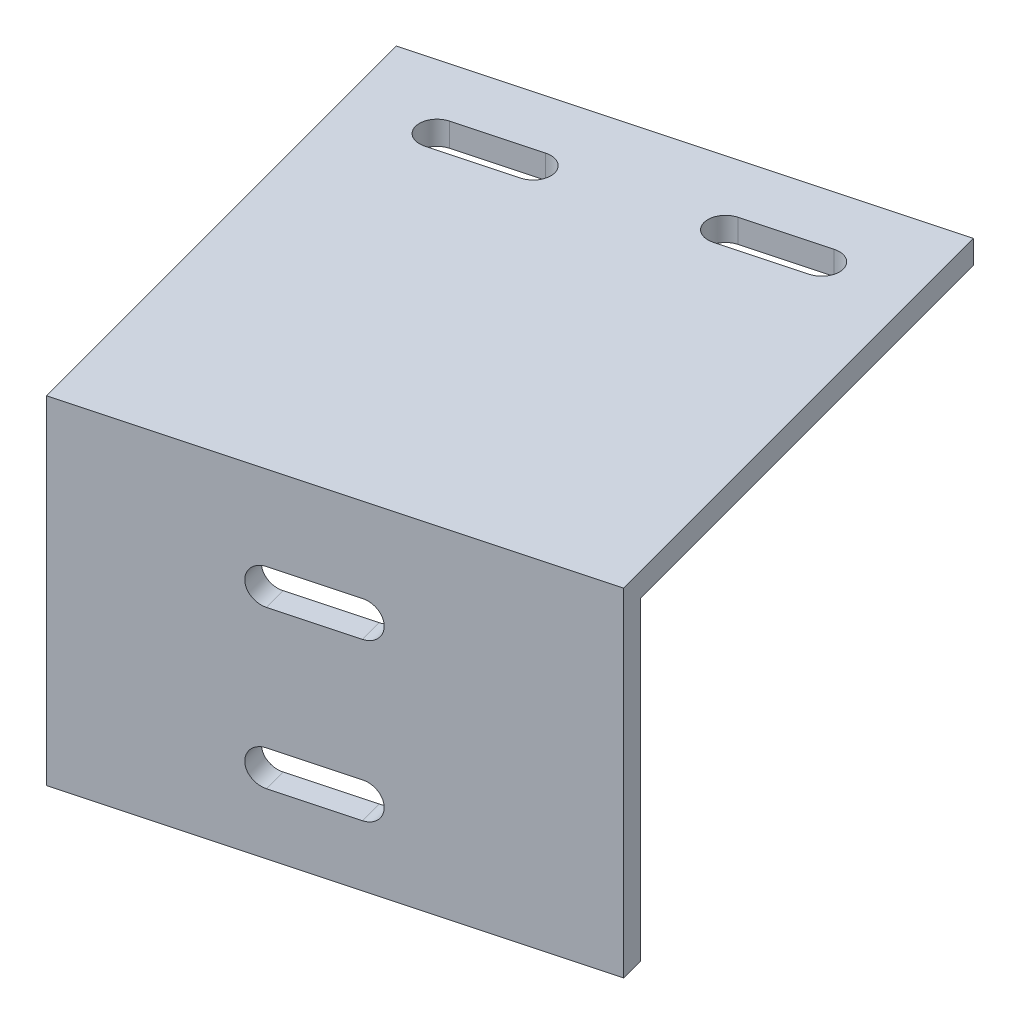
ISO-10303-21;
HEADER;
FILE_DESCRIPTION(('STEP AP214'),'2;1');
FILE_NAME('part.step','',(''),(''),'','','');
FILE_SCHEMA(('AUTOMOTIVE_DESIGN { 1 0 10303 214 1 1 1 1 }'));
ENDSEC;
DATA;
#1=APPLICATION_CONTEXT('core data for automotive mechanical design processes');
#2=APPLICATION_PROTOCOL_DEFINITION('international standard','automotive_design',2000,#1);
#3=PRODUCT_CONTEXT('',#1,'mechanical');
#4=PRODUCT('Part','Part','',(#3));
#5=PRODUCT_RELATED_PRODUCT_CATEGORY('part','',(#4));
#6=PRODUCT_DEFINITION_FORMATION('','',#4);
#7=PRODUCT_DEFINITION_CONTEXT('part definition',#1,'design');
#8=PRODUCT_DEFINITION('design','',#6,#7);
#9=PRODUCT_DEFINITION_SHAPE('','',#8);
#10=(LENGTH_UNIT() NAMED_UNIT(*) SI_UNIT(.MILLI.,.METRE.));
#11=(NAMED_UNIT(*) PLANE_ANGLE_UNIT() SI_UNIT($,.RADIAN.));
#12=(NAMED_UNIT(*) SI_UNIT($,.STERADIAN.) SOLID_ANGLE_UNIT());
#13=UNCERTAINTY_MEASURE_WITH_UNIT(LENGTH_MEASURE(1.E-05),#10,'distance_accuracy_value','');
#14=(GEOMETRIC_REPRESENTATION_CONTEXT(3) GLOBAL_UNCERTAINTY_ASSIGNED_CONTEXT((#13)) GLOBAL_UNIT_ASSIGNED_CONTEXT((#10,
#11,#12)) REPRESENTATION_CONTEXT('',''));
#15=CARTESIAN_POINT('',(0.,0.,0.));
#16=DIRECTION('',(0.,0.,1.));
#17=DIRECTION('',(1.,0.,0.));
#18=AXIS2_PLACEMENT_3D('',#15,#16,#17);
#19=CARTESIAN_POINT('',(602.4097368096,-56.5,1913.857974836));
#20=DIRECTION('',(0.,-1.,0.));
#21=DIRECTION('',(0.,0.,-1.));
#22=AXIS2_PLACEMENT_3D('',#19,#20,#21);
#23=PLANE('',#22);
#24=DIRECTION('',(0.258819045102985,0.,0.965925826288944));
#25=VECTOR('',#24,1.);
#26=CARTESIAN_POINT('',(583.09122028382,-56.5,1919.034355738));
#27=LINE('',#26,#25);
#28=CARTESIAN_POINT('',(583.09380847427,-56.5,1919.044014997));
#29=VERTEX_POINT('',#28);
#30=CARTESIAN_POINT('',(584.64672274488,-56.5,1924.839569954));
#31=VERTEX_POINT('',#30);
#32=EDGE_CURVE('E11',#29,#31,#27,.T.);
#33=ORIENTED_EDGE('',*,*,#32,.T.);
#34=DIRECTION('',(0.965925826288944,0.,-0.258819045102985));
#35=VECTOR('',#34,1.);
#36=CARTESIAN_POINT('',(572.22838771132,-56.5,1928.167052798));
#37=LINE('',#36,#35);
#38=CARTESIAN_POINT('',(603.96523927067,-56.5,1919.663189052));
#39=VERTEX_POINT('',#38);
#40=EDGE_CURVE('E191',#31,#39,#37,.T.);
#41=ORIENTED_EDGE('',*,*,#40,.T.);
#42=DIRECTION('',(0.258819045102985,0.,0.965925826288944));
#43=VECTOR('',#42,1.);
#44=CARTESIAN_POINT('',(602.4097368096,-56.5,1913.857974836));
#45=LINE('',#44,#43);
#46=CARTESIAN_POINT('',(602.41232500005,-56.5,1913.867634095));
#47=VERTEX_POINT('',#46);
#48=EDGE_CURVE('E20',#47,#39,#45,.T.);
#49=ORIENTED_EDGE('',*,*,#48,.F.);
#50=DIRECTION('',(0.965925826288944,0.,-0.258819045102985));
#51=VECTOR('',#50,1.);
#52=CARTESIAN_POINT('',(570.67547344071,-56.5,1922.37149784));
#53=LINE('',#52,#51);
#54=EDGE_CURVE('E231',#29,#47,#53,.T.);
#55=ORIENTED_EDGE('',*,*,#54,.F.);
#56=EDGE_LOOP('',(#33,#41,#49,#55));
#57=FACE_BOUND('',#56,.T.);
#58=ADVANCED_FACE('F17',(#57),#23,.F.);
#59=CARTESIAN_POINT('',(583.09122028382,-52.,1919.034355738));
#60=DIRECTION('',(-0.258819045102985,0.,-0.965925826288944));
#61=DIRECTION('',(0.,-1.,0.));
#62=AXIS2_PLACEMENT_3D('',#59,#60,#61);
#63=CYLINDRICAL_SURFACE('',#62,4.5);
#64=DIRECTION('',(0.258819045102985,0.,0.965925826288944));
#65=VECTOR('',#64,1.);
#66=CARTESIAN_POINT('',(583.09122028382,-47.5,1919.034355738));
#67=LINE('',#66,#65);
#68=CARTESIAN_POINT('',(583.09380847427,-47.5,1919.044014997));
#69=VERTEX_POINT('',#68);
#70=CARTESIAN_POINT('',(584.64672274488,-47.5,1924.839569954));
#71=VERTEX_POINT('',#70);
#72=EDGE_CURVE('E76',#69,#71,#67,.T.);
#73=ORIENTED_EDGE('',*,*,#72,.T.);
#74=CARTESIAN_POINT('',(584.64672274488,-52.,1924.839569954));
#75=DIRECTION('',(-0.258819045102985,0.,-0.965925826288944));
#76=DIRECTION('',(0.,-1.,0.));
#77=AXIS2_PLACEMENT_3D('',#74,#75,#76);
#78=CIRCLE('',#77,4.5);
#79=EDGE_CURVE('E194',#31,#71,#78,.T.);
#80=ORIENTED_EDGE('',*,*,#79,.F.);
#81=ORIENTED_EDGE('',*,*,#32,.F.);
#82=CARTESIAN_POINT('',(583.09380847427,-52.,1919.044014997));
#83=DIRECTION('',(-0.258819045102985,0.,-0.965925826288944));
#84=DIRECTION('',(0.,-1.,0.));
#85=AXIS2_PLACEMENT_3D('',#82,#83,#84);
#86=CIRCLE('',#85,4.5);
#87=EDGE_CURVE('E228',#29,#69,#86,.T.);
#88=ORIENTED_EDGE('',*,*,#87,.T.);
#89=EDGE_LOOP('',(#73,#80,#81,#88));
#90=FACE_BOUND('',#89,.T.);
#91=ADVANCED_FACE('F551',(#90),#63,.F.);
#92=CARTESIAN_POINT('',(602.4097368096,-52.,1913.857974836));
#93=DIRECTION('',(-0.258819045102985,0.,-0.965925826288944));
#94=DIRECTION('',(0.,1.,0.));
#95=AXIS2_PLACEMENT_3D('',#92,#93,#94);
#96=CYLINDRICAL_SURFACE('',#95,4.5);
#97=ORIENTED_EDGE('',*,*,#48,.T.);
#98=CARTESIAN_POINT('',(603.96523927067,-52.,1919.663189052));
#99=DIRECTION('',(-0.258819045102985,0.,-0.965925826288944));
#100=DIRECTION('',(0.,1.,0.));
#101=AXIS2_PLACEMENT_3D('',#98,#99,#100);
#102=CIRCLE('',#101,4.5);
#103=CARTESIAN_POINT('',(603.96523927067,-47.5,1919.663189052));
#104=VERTEX_POINT('',#103);
#105=EDGE_CURVE('E183',#104,#39,#102,.T.);
#106=ORIENTED_EDGE('',*,*,#105,.F.);
#107=DIRECTION('',(0.258819045102985,0.,0.965925826288944));
#108=VECTOR('',#107,1.);
#109=CARTESIAN_POINT('',(602.4097368096,-47.5,1913.857974836));
#110=LINE('',#109,#108);
#111=CARTESIAN_POINT('',(602.41232500005,-47.5,1913.867634095));
#112=VERTEX_POINT('',#111);
#113=EDGE_CURVE('E39',#112,#104,#110,.T.);
#114=ORIENTED_EDGE('',*,*,#113,.F.);
#115=CARTESIAN_POINT('',(602.41232500005,-52.,1913.867634095));
#116=DIRECTION('',(-0.258819045102985,0.,-0.965925826288944));
#117=DIRECTION('',(0.,1.,0.));
#118=AXIS2_PLACEMENT_3D('',#115,#116,#117);
#119=CIRCLE('',#118,4.5);
#120=EDGE_CURVE('E186',#112,#47,#119,.T.);
#121=ORIENTED_EDGE('',*,*,#120,.T.);
#122=EDGE_LOOP('',(#97,#106,#114,#121));
#123=FACE_BOUND('',#122,.T.);
#124=ADVANCED_FACE('F181',(#123),#96,.F.);
#125=CARTESIAN_POINT('',(583.09122028382,-47.5,1919.034355738));
#126=DIRECTION('',(0.,1.,0.));
#127=DIRECTION('',(1.,0.,0.));
#128=AXIS2_PLACEMENT_3D('',#125,#126,#127);
#129=PLANE('',#128);
#130=ORIENTED_EDGE('',*,*,#113,.T.);
#131=DIRECTION('',(-0.965925826288944,0.,0.258819045102985));
#132=VECTOR('',#131,1.);
#133=CARTESIAN_POINT('',(562.56912944843,-47.5,1930.755243249));
#134=LINE('',#133,#132);
#135=EDGE_CURVE('E198',#104,#71,#134,.T.);
#136=ORIENTED_EDGE('',*,*,#135,.T.);
#137=ORIENTED_EDGE('',*,*,#72,.F.);
#138=DIRECTION('',(-0.965925826288944,0.,0.258819045102985));
#139=VECTOR('',#138,1.);
#140=CARTESIAN_POINT('',(561.01621517782,-47.5,1924.959688291));
#141=LINE('',#140,#139);
#142=EDGE_CURVE('E247',#112,#69,#141,.T.);
#143=ORIENTED_EDGE('',*,*,#142,.F.);
#144=EDGE_LOOP('',(#130,#136,#137,#143));
#145=FACE_BOUND('',#144,.T.);
#146=ADVANCED_FACE('F560',(#145),#129,.F.);
#147=CARTESIAN_POINT('',(602.4097368096,-92.,1913.857974836));
#148=DIRECTION('',(-0.258819045102985,0.,-0.965925826288944));
#149=DIRECTION('',(0.,1.,0.));
#150=AXIS2_PLACEMENT_3D('',#147,#148,#149);
#151=CYLINDRICAL_SURFACE('',#150,4.5);
#152=DIRECTION('',(0.258819045102985,0.,0.965925826288944));
#153=VECTOR('',#152,1.);
#154=CARTESIAN_POINT('',(602.4097368096,-96.5,1913.857974836));
#155=LINE('',#154,#153);
#156=CARTESIAN_POINT('',(602.41232500005,-96.5,1913.867634095));
#157=VERTEX_POINT('',#156);
#158=CARTESIAN_POINT('',(603.96523927067,-96.5,1919.663189052));
#159=VERTEX_POINT('',#158);
#160=EDGE_CURVE('E209',#157,#159,#155,.T.);
#161=ORIENTED_EDGE('',*,*,#160,.T.);
#162=CARTESIAN_POINT('',(603.96523927067,-92.,1919.663189052));
#163=DIRECTION('',(-0.258819045102985,0.,-0.965925826288944));
#164=DIRECTION('',(0.,1.,0.));
#165=AXIS2_PLACEMENT_3D('',#162,#163,#164);
#166=CIRCLE('',#165,4.5);
#167=CARTESIAN_POINT('',(603.96523927067,-87.5,1919.663189052));
#168=VERTEX_POINT('',#167);
#169=EDGE_CURVE('E340',#168,#159,#166,.T.);
#170=ORIENTED_EDGE('',*,*,#169,.F.);
#171=DIRECTION('',(0.258819045102985,0.,0.965925826288944));
#172=VECTOR('',#171,1.);
#173=CARTESIAN_POINT('',(602.4097368096,-87.5,1913.857974836));
#174=LINE('',#173,#172);
#175=CARTESIAN_POINT('',(602.41232500005,-87.5,1913.867634095));
#176=VERTEX_POINT('',#175);
#177=EDGE_CURVE('E232',#176,#168,#174,.T.);
#178=ORIENTED_EDGE('',*,*,#177,.F.);
#179=CARTESIAN_POINT('',(602.41232500005,-92.,1913.867634095));
#180=DIRECTION('',(-0.258819045102985,0.,-0.965925826288944));
#181=DIRECTION('',(0.,1.,0.));
#182=AXIS2_PLACEMENT_3D('',#179,#180,#181);
#183=CIRCLE('',#182,4.5);
#184=EDGE_CURVE('E219',#176,#157,#183,.T.);
#185=ORIENTED_EDGE('',*,*,#184,.T.);
#186=EDGE_LOOP('',(#161,#170,#178,#185));
#187=FACE_BOUND('',#186,.T.);
#188=ADVANCED_FACE('F565',(#187),#151,.F.);
#189=CARTESIAN_POINT('',(602.4097368096,-96.5,1913.857974836));
#190=DIRECTION('',(0.,-1.,0.));
#191=DIRECTION('',(0.,0.,-1.));
#192=AXIS2_PLACEMENT_3D('',#189,#190,#191);
#193=PLANE('',#192);
#194=DIRECTION('',(0.258819045102985,0.,0.965925826288944));
#195=VECTOR('',#194,1.);
#196=CARTESIAN_POINT('',(583.09122028382,-96.5,1919.034355738));
#197=LINE('',#196,#195);
#198=CARTESIAN_POINT('',(583.09380847427,-96.5,1919.044014997));
#199=VERTEX_POINT('',#198);
#200=CARTESIAN_POINT('',(584.64672274488,-96.5,1924.839569954));
#201=VERTEX_POINT('',#200);
#202=EDGE_CURVE('E212',#199,#201,#197,.T.);
#203=ORIENTED_EDGE('',*,*,#202,.T.);
#204=DIRECTION('',(0.965925826288944,0.,-0.258819045102985));
#205=VECTOR('',#204,1.);
#206=CARTESIAN_POINT('',(572.22838771132,-96.5,1928.167052798));
#207=LINE('',#206,#205);
#208=EDGE_CURVE('E345',#201,#159,#207,.T.);
#209=ORIENTED_EDGE('',*,*,#208,.T.);
#210=ORIENTED_EDGE('',*,*,#160,.F.);
#211=DIRECTION('',(0.965925826288944,0.,-0.258819045102985));
#212=VECTOR('',#211,1.);
#213=CARTESIAN_POINT('',(570.67547344071,-96.5,1922.37149784));
#214=LINE('',#213,#212);
#215=EDGE_CURVE('E224',#199,#157,#214,.T.);
#216=ORIENTED_EDGE('',*,*,#215,.F.);
#217=EDGE_LOOP('',(#203,#209,#210,#216));
#218=FACE_BOUND('',#217,.T.);
#219=ADVANCED_FACE('F568',(#218),#193,.F.);
#220=CARTESIAN_POINT('',(583.09122028382,-92.,1919.034355738));
#221=DIRECTION('',(-0.258819045102985,0.,-0.965925826288944));
#222=DIRECTION('',(0.,-1.,0.));
#223=AXIS2_PLACEMENT_3D('',#220,#221,#222);
#224=CYLINDRICAL_SURFACE('',#223,4.5);
#225=DIRECTION('',(0.258819045102985,0.,0.965925826288944));
#226=VECTOR('',#225,1.);
#227=CARTESIAN_POINT('',(583.09122028382,-87.5,1919.034355738));
#228=LINE('',#227,#226);
#229=CARTESIAN_POINT('',(583.09380847427,-87.5,1919.044014997));
#230=VERTEX_POINT('',#229);
#231=CARTESIAN_POINT('',(584.64672274488,-87.5,1924.839569954));
#232=VERTEX_POINT('',#231);
#233=EDGE_CURVE('E235',#230,#232,#228,.T.);
#234=ORIENTED_EDGE('',*,*,#233,.T.);
#235=CARTESIAN_POINT('',(584.64672274488,-92.,1924.839569954));
#236=DIRECTION('',(-0.258819045102985,0.,-0.965925826288944));
#237=DIRECTION('',(0.,-1.,0.));
#238=AXIS2_PLACEMENT_3D('',#235,#236,#237);
#239=CIRCLE('',#238,4.5);
#240=EDGE_CURVE('E204',#201,#232,#239,.T.);
#241=ORIENTED_EDGE('',*,*,#240,.F.);
#242=ORIENTED_EDGE('',*,*,#202,.F.);
#243=CARTESIAN_POINT('',(583.09380847427,-92.,1919.044014997));
#244=DIRECTION('',(-0.258819045102985,0.,-0.965925826288944));
#245=DIRECTION('',(0.,-1.,0.));
#246=AXIS2_PLACEMENT_3D('',#243,#244,#245);
#247=CIRCLE('',#246,4.5);
#248=EDGE_CURVE('E286',#199,#230,#247,.T.);
#249=ORIENTED_EDGE('',*,*,#248,.T.);
#250=EDGE_LOOP('',(#234,#241,#242,#249));
#251=FACE_BOUND('',#250,.T.);
#252=ADVANCED_FACE('F572',(#251),#224,.F.);
#253=CARTESIAN_POINT('',(583.09122028382,-87.5,1919.034355738));
#254=DIRECTION('',(0.,1.,0.));
#255=DIRECTION('',(1.,0.,0.));
#256=AXIS2_PLACEMENT_3D('',#253,#254,#255);
#257=PLANE('',#256);
#258=ORIENTED_EDGE('',*,*,#177,.T.);
#259=DIRECTION('',(-0.965925826288944,0.,0.258819045102985));
#260=VECTOR('',#259,1.);
#261=CARTESIAN_POINT('',(562.56912944843,-87.5,1930.755243249));
#262=LINE('',#261,#260);
#263=EDGE_CURVE('E336',#168,#232,#262,.T.);
#264=ORIENTED_EDGE('',*,*,#263,.T.);
#265=ORIENTED_EDGE('',*,*,#233,.F.);
#266=DIRECTION('',(-0.965925826288944,0.,0.258819045102985));
#267=VECTOR('',#266,1.);
#268=CARTESIAN_POINT('',(561.01621517782,-87.5,1924.959688291));
#269=LINE('',#268,#267);
#270=EDGE_CURVE('E223',#176,#230,#269,.T.);
#271=ORIENTED_EDGE('',*,*,#270,.F.);
#272=EDGE_LOOP('',(#258,#264,#265,#271));
#273=FACE_BOUND('',#272,.T.);
#274=ADVANCED_FACE('F575',(#273),#257,.F.);
#275=CARTESIAN_POINT('',(590.33078347423,-25.99,1813.577255349));
#276=DIRECTION('',(0.,1.,0.));
#277=DIRECTION('',(-0.258819045102985,0.,-0.965925826288944));
#278=AXIS2_PLACEMENT_3D('',#275,#276,#277);
#279=CYLINDRICAL_SURFACE('',#278,4.5);
#280=DIRECTION('',(0.,-1.,0.));
#281=VECTOR('',#280,1.);
#282=CARTESIAN_POINT('',(591.4954691772,-25.99,1817.923921567));
#283=LINE('',#282,#281);
#284=CARTESIAN_POINT('',(591.4954691772,-26.,1817.923921567));
#285=VERTEX_POINT('',#284);
#286=CARTESIAN_POINT('',(591.4954691772,-32.,1817.923921567));
#287=VERTEX_POINT('',#286);
#288=EDGE_CURVE('E258',#285,#287,#283,.T.);
#289=ORIENTED_EDGE('',*,*,#288,.T.);
#290=CARTESIAN_POINT('',(590.33078347423,-32.,1813.577255349));
#291=DIRECTION('',(0.,1.,0.));
#292=DIRECTION('',(-0.258819045102985,0.,-0.965925826288944));
#293=AXIS2_PLACEMENT_3D('',#290,#291,#292);
#294=CIRCLE('',#293,4.5);
#295=CARTESIAN_POINT('',(589.16609777127,-32.,1809.23058913));
#296=VERTEX_POINT('',#295);
#297=EDGE_CURVE('E379',#296,#287,#294,.T.);
#298=ORIENTED_EDGE('',*,*,#297,.F.);
#299=DIRECTION('',(0.,-1.,0.));
#300=VECTOR('',#299,1.);
#301=CARTESIAN_POINT('',(589.16609777127,-25.99,1809.23058913));
#302=LINE('',#301,#300);
#303=CARTESIAN_POINT('',(589.16609777127,-26.,1809.23058913));
#304=VERTEX_POINT('',#303);
#305=EDGE_CURVE('E236',#304,#296,#302,.T.);
#306=ORIENTED_EDGE('',*,*,#305,.F.);
#307=CARTESIAN_POINT('',(590.33078347423,-26.,1813.577255349));
#308=DIRECTION('',(0.,1.,0.));
#309=DIRECTION('',(-0.258819045102985,0.,-0.965925826288944));
#310=AXIS2_PLACEMENT_3D('',#307,#308,#309);
#311=CIRCLE('',#310,4.5);
#312=EDGE_CURVE('E309',#304,#285,#311,.T.);
#313=ORIENTED_EDGE('',*,*,#312,.T.);
#314=EDGE_LOOP('',(#289,#298,#306,#313));
#315=FACE_BOUND('',#314,.T.);
#316=ADVANCED_FACE('F436',(#315),#279,.F.);
#317=CARTESIAN_POINT('',(608.48461429705,-25.99,1804.054208228));
#318=DIRECTION('',(-0.258819045102985,0.,-0.965925826288944));
#319=DIRECTION('',(-0.965925826288944,0.,0.258819045102985));
#320=AXIS2_PLACEMENT_3D('',#317,#318,#319);
#321=PLANE('',#320);
#322=ORIENTED_EDGE('',*,*,#305,.T.);
#323=DIRECTION('',(-0.965925826288944,0.,0.258819045102985));
#324=VECTOR('',#323,1.);
#325=CARTESIAN_POINT('',(560.1883229826,-32.,1816.995160484));
#326=LINE('',#325,#324);
#327=CARTESIAN_POINT('',(608.48461429705,-32.,1804.054208228));
#328=VERTEX_POINT('',#327);
#329=EDGE_CURVE('E376',#328,#296,#326,.T.);
#330=ORIENTED_EDGE('',*,*,#329,.F.);
#331=DIRECTION('',(0.,-1.,0.));
#332=VECTOR('',#331,1.);
#333=CARTESIAN_POINT('',(608.48461429705,-25.99,1804.054208228));
#334=LINE('',#333,#332);
#335=CARTESIAN_POINT('',(608.48461429705,-26.,1804.054208228));
#336=VERTEX_POINT('',#335);
#337=EDGE_CURVE('E255',#336,#328,#334,.T.);
#338=ORIENTED_EDGE('',*,*,#337,.F.);
#339=DIRECTION('',(-0.965925826288944,0.,0.258819045102985));
#340=VECTOR('',#339,1.);
#341=CARTESIAN_POINT('',(560.1883229826,-26.,1816.995160484));
#342=LINE('',#341,#340);
#343=EDGE_CURVE('E304',#336,#304,#342,.T.);
#344=ORIENTED_EDGE('',*,*,#343,.T.);
#345=EDGE_LOOP('',(#322,#330,#338,#344));
#346=FACE_BOUND('',#345,.T.);
#347=ADVANCED_FACE('F432',(#346),#321,.F.);
#348=CARTESIAN_POINT('',(609.64930000002,-25.99,1808.400874447));
#349=DIRECTION('',(0.,1.,0.));
#350=DIRECTION('',(0.258819045102985,0.,0.965925826288944));
#351=AXIS2_PLACEMENT_3D('',#348,#349,#350);
#352=CYLINDRICAL_SURFACE('',#351,4.5);
#353=ORIENTED_EDGE('',*,*,#337,.T.);
#354=CARTESIAN_POINT('',(609.64930000002,-32.,1808.400874447));
#355=DIRECTION('',(0.,1.,0.));
#356=DIRECTION('',(0.258819045102985,0.,0.965925826288944));
#357=AXIS2_PLACEMENT_3D('',#354,#355,#356);
#358=CIRCLE('',#357,4.5);
#359=CARTESIAN_POINT('',(610.81398570298,-32.,1812.747540665));
#360=VERTEX_POINT('',#359);
#361=EDGE_CURVE('E380',#360,#328,#358,.T.);
#362=ORIENTED_EDGE('',*,*,#361,.F.);
#363=DIRECTION('',(0.,-1.,0.));
#364=VECTOR('',#363,1.);
#365=CARTESIAN_POINT('',(610.81398570298,-25.99,1812.747540665));
#366=LINE('',#365,#364);
#367=CARTESIAN_POINT('',(610.81398570298,-26.,1812.747540665));
#368=VERTEX_POINT('',#367);
#369=EDGE_CURVE('E241',#368,#360,#366,.T.);
#370=ORIENTED_EDGE('',*,*,#369,.F.);
#371=CARTESIAN_POINT('',(609.64930000002,-26.,1808.400874447));
#372=DIRECTION('',(0.,1.,0.));
#373=DIRECTION('',(0.258819045102985,0.,0.965925826288944));
#374=AXIS2_PLACEMENT_3D('',#371,#372,#373);
#375=CIRCLE('',#374,4.5);
#376=EDGE_CURVE('E308',#368,#336,#375,.T.);
#377=ORIENTED_EDGE('',*,*,#376,.T.);
#378=EDGE_LOOP('',(#353,#362,#370,#377));
#379=FACE_BOUND('',#378,.T.);
#380=ADVANCED_FACE('F427',(#379),#352,.F.);
#381=CARTESIAN_POINT('',(591.4954691772,-25.99,1817.923921567));
#382=DIRECTION('',(0.258819045102985,0.,0.965925826288944));
#383=DIRECTION('',(0.,-1.,0.));
#384=AXIS2_PLACEMENT_3D('',#381,#382,#383);
#385=PLANE('',#384);
#386=ORIENTED_EDGE('',*,*,#369,.T.);
#387=DIRECTION('',(0.965925826288944,0.,-0.258819045102985));
#388=VECTOR('',#387,1.);
#389=CARTESIAN_POINT('',(552.85843612563,-32.,1828.276683371));
#390=LINE('',#389,#388);
#391=EDGE_CURVE('E271',#287,#360,#390,.T.);
#392=ORIENTED_EDGE('',*,*,#391,.F.);
#393=ORIENTED_EDGE('',*,*,#288,.F.);
#394=DIRECTION('',(0.965925826288944,0.,-0.258819045102985));
#395=VECTOR('',#394,1.);
#396=CARTESIAN_POINT('',(552.85843612563,-26.,1828.276683371));
#397=LINE('',#396,#395);
#398=EDGE_CURVE('E314',#285,#368,#397,.T.);
#399=ORIENTED_EDGE('',*,*,#398,.T.);
#400=EDGE_LOOP('',(#386,#392,#393,#399));
#401=FACE_BOUND('',#400,.T.);
#402=ADVANCED_FACE('F581',(#401),#385,.F.);
#403=CARTESIAN_POINT('',(550.52906471971,-25.99,1819.583350935));
#404=DIRECTION('',(-0.258819045102985,0.,-0.965925826288944));
#405=DIRECTION('',(-0.965925826288944,0.,0.258819045102985));
#406=AXIS2_PLACEMENT_3D('',#403,#404,#405);
#407=PLANE('',#406);
#408=DIRECTION('',(0.,-1.,0.));
#409=VECTOR('',#408,1.);
#410=CARTESIAN_POINT('',(531.21054819393,-25.99,1824.759731837));
#411=LINE('',#410,#409);
#412=CARTESIAN_POINT('',(531.21054819393,-26.,1824.759731837));
#413=VERTEX_POINT('',#412);
#414=CARTESIAN_POINT('',(531.21054819393,-32.,1824.759731837));
#415=VERTEX_POINT('',#414);
#416=EDGE_CURVE('E242',#413,#415,#411,.T.);
#417=ORIENTED_EDGE('',*,*,#416,.T.);
#418=DIRECTION('',(-0.965925826288944,0.,0.258819045102985));
#419=VECTOR('',#418,1.);
#420=CARTESIAN_POINT('',(531.21054819393,-32.,1824.759731837));
#421=LINE('',#420,#419);
#422=CARTESIAN_POINT('',(550.52906471971,-32.,1819.583350935));
#423=VERTEX_POINT('',#422);
#424=EDGE_CURVE('E365',#423,#415,#421,.T.);
#425=ORIENTED_EDGE('',*,*,#424,.F.);
#426=DIRECTION('',(0.,-1.,0.));
#427=VECTOR('',#426,1.);
#428=CARTESIAN_POINT('',(550.52906471971,-25.99,1819.583350935));
#429=LINE('',#428,#427);
#430=CARTESIAN_POINT('',(550.52906471971,-26.,1819.583350935));
#431=VERTEX_POINT('',#430);
#432=EDGE_CURVE('E237',#431,#423,#429,.T.);
#433=ORIENTED_EDGE('',*,*,#432,.F.);
#434=DIRECTION('',(-0.965925826288944,0.,0.258819045102985));
#435=VECTOR('',#434,1.);
#436=CARTESIAN_POINT('',(531.21054819393,-26.,1824.759731837));
#437=LINE('',#436,#435);
#438=EDGE_CURVE('E301',#431,#413,#437,.T.);
#439=ORIENTED_EDGE('',*,*,#438,.T.);
#440=EDGE_LOOP('',(#417,#425,#433,#439));
#441=FACE_BOUND('',#440,.T.);
#442=ADVANCED_FACE('F509',(#441),#407,.F.);
#443=CARTESIAN_POINT('',(551.69375042267,-25.99,1823.930017153));
#444=DIRECTION('',(0.,1.,0.));
#445=DIRECTION('',(0.258819045102985,0.,0.965925826288944));
#446=AXIS2_PLACEMENT_3D('',#443,#444,#445);
#447=CYLINDRICAL_SURFACE('',#446,4.5);
#448=ORIENTED_EDGE('',*,*,#432,.T.);
#449=CARTESIAN_POINT('',(551.69375042267,-32.,1823.930017153));
#450=DIRECTION('',(0.,1.,0.));
#451=DIRECTION('',(0.258819045102985,0.,0.965925826288944));
#452=AXIS2_PLACEMENT_3D('',#449,#450,#451);
#453=CIRCLE('',#452,4.5);
#454=CARTESIAN_POINT('',(552.85843612563,-32.,1828.276683371));
#455=VERTEX_POINT('',#454);
#456=EDGE_CURVE('E398',#455,#423,#453,.T.);
#457=ORIENTED_EDGE('',*,*,#456,.F.);
#458=DIRECTION('',(0.,-1.,0.));
#459=VECTOR('',#458,1.);
#460=CARTESIAN_POINT('',(552.85843612563,-25.99,1828.276683371));
#461=LINE('',#460,#459);
#462=CARTESIAN_POINT('',(552.85843612563,-26.,1828.276683371));
#463=VERTEX_POINT('',#462);
#464=EDGE_CURVE('E248',#463,#455,#461,.T.);
#465=ORIENTED_EDGE('',*,*,#464,.F.);
#466=CARTESIAN_POINT('',(551.69375042267,-26.,1823.930017153));
#467=DIRECTION('',(0.,1.,0.));
#468=DIRECTION('',(0.258819045102985,0.,0.965925826288944));
#469=AXIS2_PLACEMENT_3D('',#466,#467,#468);
#470=CIRCLE('',#469,4.5);
#471=EDGE_CURVE('E310',#463,#431,#470,.T.);
#472=ORIENTED_EDGE('',*,*,#471,.T.);
#473=EDGE_LOOP('',(#448,#457,#465,#472));
#474=FACE_BOUND('',#473,.T.);
#475=ADVANCED_FACE('F505',(#474),#447,.F.);
#476=CARTESIAN_POINT('',(532.37523389689,-25.99,1829.106398055));
#477=DIRECTION('',(0.,1.,0.));
#478=DIRECTION('',(-0.258819045102985,0.,-0.965925826288944));
#479=AXIS2_PLACEMENT_3D('',#476,#477,#478);
#480=CYLINDRICAL_SURFACE('',#479,4.5);
#481=DIRECTION('',(0.,-1.,0.));
#482=VECTOR('',#481,1.);
#483=CARTESIAN_POINT('',(533.53991959985,-25.99,1833.453064273));
#484=LINE('',#483,#482);
#485=CARTESIAN_POINT('',(533.53991959985,-26.,1833.453064273));
#486=VERTEX_POINT('',#485);
#487=CARTESIAN_POINT('',(533.53991959985,-32.,1833.453064273));
#488=VERTEX_POINT('',#487);
#489=EDGE_CURVE('E252',#486,#488,#484,.T.);
#490=ORIENTED_EDGE('',*,*,#489,.T.);
#491=CARTESIAN_POINT('',(532.37523389689,-32.,1829.106398055));
#492=DIRECTION('',(0.,1.,0.));
#493=DIRECTION('',(-0.258819045102985,0.,-0.965925826288944));
#494=AXIS2_PLACEMENT_3D('',#491,#492,#493);
#495=CIRCLE('',#494,4.5);
#496=EDGE_CURVE('E361',#415,#488,#495,.T.);
#497=ORIENTED_EDGE('',*,*,#496,.F.);
#498=ORIENTED_EDGE('',*,*,#416,.F.);
#499=CARTESIAN_POINT('',(532.37523389689,-26.,1829.106398055));
#500=DIRECTION('',(0.,1.,0.));
#501=DIRECTION('',(-0.258819045102985,0.,-0.965925826288944));
#502=AXIS2_PLACEMENT_3D('',#499,#500,#501);
#503=CIRCLE('',#502,4.5);
#504=EDGE_CURVE('E297',#413,#486,#503,.T.);
#505=ORIENTED_EDGE('',*,*,#504,.T.);
#506=EDGE_LOOP('',(#490,#497,#498,#505));
#507=FACE_BOUND('',#506,.T.);
#508=ADVANCED_FACE('F516',(#507),#480,.F.);
#509=CARTESIAN_POINT('',(533.53991959985,-25.99,1833.453064273));
#510=DIRECTION('',(0.258819045102985,0.,0.965925826288944));
#511=DIRECTION('',(0.,-1.,0.));
#512=AXIS2_PLACEMENT_3D('',#509,#510,#511);
#513=PLANE('',#512);
#514=ORIENTED_EDGE('',*,*,#464,.T.);
#515=DIRECTION('',(0.965925826288944,0.,-0.258819045102985));
#516=VECTOR('',#515,1.);
#517=CARTESIAN_POINT('',(523.88066133696,-32.,1836.041254724));
#518=LINE('',#517,#516);
#519=EDGE_CURVE('E364',#488,#455,#518,.T.);
#520=ORIENTED_EDGE('',*,*,#519,.F.);
#521=ORIENTED_EDGE('',*,*,#489,.F.);
#522=DIRECTION('',(0.965925826288944,0.,-0.258819045102985));
#523=VECTOR('',#522,1.);
#524=CARTESIAN_POINT('',(523.88066133696,-26.,1836.041254724));
#525=LINE('',#524,#523);
#526=EDGE_CURVE('E293',#486,#463,#525,.T.);
#527=ORIENTED_EDGE('',*,*,#526,.T.);
#528=EDGE_LOOP('',(#514,#520,#521,#527));
#529=FACE_BOUND('',#528,.T.);
#530=ADVANCED_FACE('F512',(#529),#513,.F.);
#531=CARTESIAN_POINT('',(623.79143562375,-32.,1783.905977019));
#532=DIRECTION('',(0.965925826288944,0.,-0.258819045102985));
#533=DIRECTION('',(0.,-1.,0.));
#534=AXIS2_PLACEMENT_3D('',#531,#532,#533);
#535=PLANE('',#534);
#536=DIRECTION('',(0.258819045102985,0.,0.965925826288944));
#537=VECTOR('',#536,1.);
#538=CARTESIAN_POINT('',(623.79143562375,-32.,1783.905977019));
#539=LINE('',#538,#537);
#540=CARTESIAN_POINT('',(623.79143562375,-32.,1783.905977019));
#541=VERTEX_POINT('',#540);
#542=CARTESIAN_POINT('',(654.84972103605,-32.,1899.817076174));
#543=VERTEX_POINT('',#542);
#544=EDGE_CURVE('E394',#541,#543,#539,.T.);
#545=ORIENTED_EDGE('',*,*,#544,.F.);
#546=DIRECTION('',(0.,1.,0.));
#547=VECTOR('',#546,1.);
#548=CARTESIAN_POINT('',(623.79143562375,-32.,1783.905977019));
#549=LINE('',#548,#547);
#550=CARTESIAN_POINT('',(623.79143562375,-26.,1783.905977019));
#551=VERTEX_POINT('',#550);
#552=EDGE_CURVE('E275',#541,#551,#549,.T.);
#553=ORIENTED_EDGE('',*,*,#552,.T.);
#554=DIRECTION('',(-0.258819045102985,0.,-0.965925826288944));
#555=VECTOR('',#554,1.);
#556=CARTESIAN_POINT('',(656.40263530666,-26.,1905.612631131));
#557=LINE('',#556,#555);
#558=CARTESIAN_POINT('',(656.40263530666,-26.,1905.612631131));
#559=VERTEX_POINT('',#558);
#560=EDGE_CURVE('E290',#559,#551,#557,.T.);
#561=ORIENTED_EDGE('',*,*,#560,.F.);
#562=DIRECTION('',(0.,-1.,0.));
#563=VECTOR('',#562,1.);
#564=CARTESIAN_POINT('',(656.40263530666,-26.,1905.612631131));
#565=LINE('',#564,#563);
#566=CARTESIAN_POINT('',(656.40263530666,-112.,1905.612631131));
#567=VERTEX_POINT('',#566);
#568=EDGE_CURVE('E332',#559,#567,#565,.T.);
#569=ORIENTED_EDGE('',*,*,#568,.T.);
#570=DIRECTION('',(0.258819045102985,0.,0.965925826288944));
#571=VECTOR('',#570,1.);
#572=CARTESIAN_POINT('',(654.84972103605,-112.,1899.817076174));
#573=LINE('',#572,#571);
#574=CARTESIAN_POINT('',(654.84972103605,-112.,1899.817076174));
#575=VERTEX_POINT('',#574);
#576=EDGE_CURVE('E218',#575,#567,#573,.T.);
#577=ORIENTED_EDGE('',*,*,#576,.F.);
#578=DIRECTION('',(0.,1.,0.));
#579=VECTOR('',#578,1.);
#580=CARTESIAN_POINT('',(654.84972103605,-112.,1899.817076174));
#581=LINE('',#580,#579);
#582=EDGE_CURVE('E217',#575,#543,#581,.T.);
#583=ORIENTED_EDGE('',*,*,#582,.T.);
#584=EDGE_LOOP('',(#545,#553,#561,#569,#577,#583));
#585=FACE_BOUND('',#584,.T.);
#586=ADVANCED_FACE('F537',(#585),#535,.T.);
#587=CARTESIAN_POINT('',(538.93862188136,-112.,1930.875361586));
#588=DIRECTION('',(0.258819045102985,0.,0.965925826288944));
#589=DIRECTION('',(0.,-1.,0.));
#590=AXIS2_PLACEMENT_3D('',#587,#588,#589);
#591=PLANE('',#590);
#592=ORIENTED_EDGE('',*,*,#87,.F.);
#593=ORIENTED_EDGE('',*,*,#54,.T.);
#594=ORIENTED_EDGE('',*,*,#120,.F.);
#595=ORIENTED_EDGE('',*,*,#142,.T.);
#596=EDGE_LOOP('',(#592,#593,#594,#595));
#597=FACE_BOUND('',#596,.T.);
#598=ORIENTED_EDGE('',*,*,#248,.F.);
#599=ORIENTED_EDGE('',*,*,#215,.T.);
#600=ORIENTED_EDGE('',*,*,#184,.F.);
#601=ORIENTED_EDGE('',*,*,#270,.T.);
#602=EDGE_LOOP('',(#598,#599,#600,#601));
#603=FACE_BOUND('',#602,.T.);
#604=DIRECTION('',(0.965925826288944,0.,-0.258819045102985));
#605=VECTOR('',#604,1.);
#606=CARTESIAN_POINT('',(538.93862188136,-32.,1930.875361586));
#607=LINE('',#606,#605);
#608=CARTESIAN_POINT('',(538.93862188136,-32.,1930.875361586));
#609=VERTEX_POINT('',#608);
#610=EDGE_CURVE('E386',#609,#543,#607,.T.);
#611=ORIENTED_EDGE('',*,*,#610,.T.);
#612=ORIENTED_EDGE('',*,*,#582,.F.);
#613=DIRECTION('',(0.965925826288944,0.,-0.258819045102985));
#614=VECTOR('',#613,1.);
#615=CARTESIAN_POINT('',(538.93862188136,-112.,1930.875361586));
#616=LINE('',#615,#614);
#617=CARTESIAN_POINT('',(538.93862188136,-112.,1930.875361586));
#618=VERTEX_POINT('',#617);
#619=EDGE_CURVE('E213',#618,#575,#616,.T.);
#620=ORIENTED_EDGE('',*,*,#619,.F.);
#621=DIRECTION('',(0.,1.,0.));
#622=VECTOR('',#621,1.);
#623=CARTESIAN_POINT('',(538.93862188136,-112.,1930.875361586));
#624=LINE('',#623,#622);
#625=EDGE_CURVE('E447',#618,#609,#624,.T.);
#626=ORIENTED_EDGE('',*,*,#625,.T.);
#627=EDGE_LOOP('',(#611,#612,#620,#626));
#628=FACE_BOUND('',#627,.T.);
#629=ADVANCED_FACE('F533',(#597,#603,#628),#591,.F.);
#630=CARTESIAN_POINT('',(538.93862188136,-112.,1930.875361586));
#631=DIRECTION('',(0.,1.,0.));
#632=DIRECTION('',(1.,0.,0.));
#633=AXIS2_PLACEMENT_3D('',#630,#631,#632);
#634=PLANE('',#633);
#635=ORIENTED_EDGE('',*,*,#576,.T.);
#636=DIRECTION('',(0.965925826288944,0.,-0.258819045102985));
#637=VECTOR('',#636,1.);
#638=CARTESIAN_POINT('',(540.49153615198,-112.,1936.670916544));
#639=LINE('',#638,#637);
#640=CARTESIAN_POINT('',(540.49153615198,-112.,1936.670916544));
#641=VERTEX_POINT('',#640);
#642=EDGE_CURVE('E328',#641,#567,#639,.T.);
#643=ORIENTED_EDGE('',*,*,#642,.F.);
#644=DIRECTION('',(0.258819045102985,0.,0.965925826288944));
#645=VECTOR('',#644,1.);
#646=CARTESIAN_POINT('',(538.93862188136,-112.,1930.875361586));
#647=LINE('',#646,#645);
#648=EDGE_CURVE('E371',#618,#641,#647,.T.);
#649=ORIENTED_EDGE('',*,*,#648,.F.);
#650=ORIENTED_EDGE('',*,*,#619,.T.);
#651=EDGE_LOOP('',(#635,#643,#649,#650));
#652=FACE_BOUND('',#651,.T.);
#653=ADVANCED_FACE('F468',(#652),#634,.F.);
#654=CARTESIAN_POINT('',(540.49153615198,-32.,1936.670916544));
#655=DIRECTION('',(0.258819045102985,0.,0.965925826288944));
#656=DIRECTION('',(0.,-1.,0.));
#657=AXIS2_PLACEMENT_3D('',#654,#655,#656);
#658=PLANE('',#657);
#659=ORIENTED_EDGE('',*,*,#135,.F.);
#660=ORIENTED_EDGE('',*,*,#105,.T.);
#661=ORIENTED_EDGE('',*,*,#40,.F.);
#662=ORIENTED_EDGE('',*,*,#79,.T.);
#663=EDGE_LOOP('',(#659,#660,#661,#662));
#664=FACE_BOUND('',#663,.T.);
#665=ORIENTED_EDGE('',*,*,#263,.F.);
#666=ORIENTED_EDGE('',*,*,#169,.T.);
#667=ORIENTED_EDGE('',*,*,#208,.F.);
#668=ORIENTED_EDGE('',*,*,#240,.T.);
#669=EDGE_LOOP('',(#665,#666,#667,#668));
#670=FACE_BOUND('',#669,.T.);
#671=DIRECTION('',(0.,1.,0.));
#672=VECTOR('',#671,1.);
#673=CARTESIAN_POINT('',(540.49153615198,-112.,1936.670916544));
#674=LINE('',#673,#672);
#675=CARTESIAN_POINT('',(540.49153615198,-26.,1936.670916544));
#676=VERTEX_POINT('',#675);
#677=EDGE_CURVE('E366',#641,#676,#674,.T.);
#678=ORIENTED_EDGE('',*,*,#677,.F.);
#679=ORIENTED_EDGE('',*,*,#642,.T.);
#680=ORIENTED_EDGE('',*,*,#568,.F.);
#681=DIRECTION('',(0.965925826288944,0.,-0.258819045102985));
#682=VECTOR('',#681,1.);
#683=CARTESIAN_POINT('',(540.49153615198,-26.,1936.670916544));
#684=LINE('',#683,#682);
#685=EDGE_CURVE('E280',#676,#559,#684,.T.);
#686=ORIENTED_EDGE('',*,*,#685,.F.);
#687=EDGE_LOOP('',(#678,#679,#680,#686));
#688=FACE_BOUND('',#687,.T.);
#689=ADVANCED_FACE('F196',(#664,#670,#688),#658,.T.);
#690=CARTESIAN_POINT('',(507.88033646906,-26.,1814.964262431));
#691=DIRECTION('',(0.,1.,0.));
#692=DIRECTION('',(1.,0.,0.));
#693=AXIS2_PLACEMENT_3D('',#690,#691,#692);
#694=PLANE('',#693);
#695=ORIENTED_EDGE('',*,*,#398,.F.);
#696=ORIENTED_EDGE('',*,*,#312,.F.);
#697=ORIENTED_EDGE('',*,*,#343,.F.);
#698=ORIENTED_EDGE('',*,*,#376,.F.);
#699=EDGE_LOOP('',(#695,#696,#697,#698));
#700=FACE_BOUND('',#699,.T.);
#701=ORIENTED_EDGE('',*,*,#526,.F.);
#702=ORIENTED_EDGE('',*,*,#504,.F.);
#703=ORIENTED_EDGE('',*,*,#438,.F.);
#704=ORIENTED_EDGE('',*,*,#471,.F.);
#705=EDGE_LOOP('',(#701,#702,#703,#704));
#706=FACE_BOUND('',#705,.T.);
#707=DIRECTION('',(0.965925826288944,0.,-0.258819045102985));
#708=VECTOR('',#707,1.);
#709=CARTESIAN_POINT('',(507.88033646906,-26.,1814.964262431));
#710=LINE('',#709,#708);
#711=CARTESIAN_POINT('',(507.88033646906,-26.,1814.964262431));
#712=VERTEX_POINT('',#711);
#713=EDGE_CURVE('E273',#712,#551,#710,.T.);
#714=ORIENTED_EDGE('',*,*,#713,.F.);
#715=DIRECTION('',(-0.258819045102985,0.,-0.965925826288944));
#716=VECTOR('',#715,1.);
#717=CARTESIAN_POINT('',(540.49153615198,-26.,1936.670916544));
#718=LINE('',#717,#716);
#719=EDGE_CURVE('E370',#676,#712,#718,.T.);
#720=ORIENTED_EDGE('',*,*,#719,.F.);
#721=ORIENTED_EDGE('',*,*,#685,.T.);
#722=ORIENTED_EDGE('',*,*,#560,.T.);
#723=EDGE_LOOP('',(#714,#720,#721,#722));
#724=FACE_BOUND('',#723,.T.);
#725=ADVANCED_FACE('F518',(#700,#706,#724),#694,.T.);
#726=CARTESIAN_POINT('',(507.88033646906,-32.,1814.964262431));
#727=DIRECTION('',(0.258819045102985,0.,0.965925826288944));
#728=DIRECTION('',(0.,-1.,0.));
#729=AXIS2_PLACEMENT_3D('',#726,#727,#728);
#730=PLANE('',#729);
#731=ORIENTED_EDGE('',*,*,#713,.T.);
#732=ORIENTED_EDGE('',*,*,#552,.F.);
#733=DIRECTION('',(0.965925826288944,0.,-0.258819045102985));
#734=VECTOR('',#733,1.);
#735=CARTESIAN_POINT('',(507.88033646906,-32.,1814.964262431));
#736=LINE('',#735,#734);
#737=CARTESIAN_POINT('',(507.88033646906,-32.,1814.964262431));
#738=VERTEX_POINT('',#737);
#739=EDGE_CURVE('E390',#738,#541,#736,.T.);
#740=ORIENTED_EDGE('',*,*,#739,.F.);
#741=DIRECTION('',(0.,1.,0.));
#742=VECTOR('',#741,1.);
#743=CARTESIAN_POINT('',(507.88033646906,-32.,1814.964262431));
#744=LINE('',#743,#742);
#745=EDGE_CURVE('E375',#738,#712,#744,.T.);
#746=ORIENTED_EDGE('',*,*,#745,.T.);
#747=EDGE_LOOP('',(#731,#732,#740,#746));
#748=FACE_BOUND('',#747,.T.);
#749=ADVANCED_FACE('F521',(#748),#730,.F.);
#750=CARTESIAN_POINT('',(507.88033646906,-32.,1814.964262431));
#751=DIRECTION('',(0.,1.,0.));
#752=DIRECTION('',(1.,0.,0.));
#753=AXIS2_PLACEMENT_3D('',#750,#751,#752);
#754=PLANE('',#753);
#755=ORIENTED_EDGE('',*,*,#361,.T.);
#756=ORIENTED_EDGE('',*,*,#329,.T.);
#757=ORIENTED_EDGE('',*,*,#297,.T.);
#758=ORIENTED_EDGE('',*,*,#391,.T.);
#759=EDGE_LOOP('',(#755,#756,#757,#758));
#760=FACE_BOUND('',#759,.T.);
#761=ORIENTED_EDGE('',*,*,#456,.T.);
#762=ORIENTED_EDGE('',*,*,#424,.T.);
#763=ORIENTED_EDGE('',*,*,#496,.T.);
#764=ORIENTED_EDGE('',*,*,#519,.T.);
#765=EDGE_LOOP('',(#761,#762,#763,#764));
#766=FACE_BOUND('',#765,.T.);
#767=ORIENTED_EDGE('',*,*,#610,.F.);
#768=DIRECTION('',(0.258819045102985,0.,0.965925826288944));
#769=VECTOR('',#768,1.);
#770=CARTESIAN_POINT('',(507.88033646906,-32.,1814.964262431));
#771=LINE('',#770,#769);
#772=EDGE_CURVE('E382',#738,#609,#771,.T.);
#773=ORIENTED_EDGE('',*,*,#772,.F.);
#774=ORIENTED_EDGE('',*,*,#739,.T.);
#775=ORIENTED_EDGE('',*,*,#544,.T.);
#776=EDGE_LOOP('',(#767,#773,#774,#775));
#777=FACE_BOUND('',#776,.T.);
#778=ADVANCED_FACE('F423',(#760,#766,#777),#754,.F.);
#779=CARTESIAN_POINT('',(507.88033646906,-32.,1814.964262431));
#780=DIRECTION('',(0.965925826288944,0.,-0.258819045102985));
#781=DIRECTION('',(0.,-1.,0.));
#782=AXIS2_PLACEMENT_3D('',#779,#780,#781);
#783=PLANE('',#782);
#784=ORIENTED_EDGE('',*,*,#625,.F.);
#785=ORIENTED_EDGE('',*,*,#648,.T.);
#786=ORIENTED_EDGE('',*,*,#677,.T.);
#787=ORIENTED_EDGE('',*,*,#719,.T.);
#788=ORIENTED_EDGE('',*,*,#745,.F.);
#789=ORIENTED_EDGE('',*,*,#772,.T.);
#790=EDGE_LOOP('',(#784,#785,#786,#787,#788,#789));
#791=FACE_BOUND('',#790,.T.);
#792=ADVANCED_FACE('F459',(#791),#783,.F.);
#793=CLOSED_SHELL('',(#58,#91,#124,#146,#188,#219,#252,#274,#316,#347,#380,#402,#442,#475,#508,
#530,#586,#629,#653,#689,#725,#749,#778,#792));
#794=MANIFOLD_SOLID_BREP('B1',#793);
#795=ADVANCED_BREP_SHAPE_REPRESENTATION('',(#18,#794),#14);
#796=SHAPE_DEFINITION_REPRESENTATION(#9,#795);
ENDSEC;
END-ISO-10303-21;
